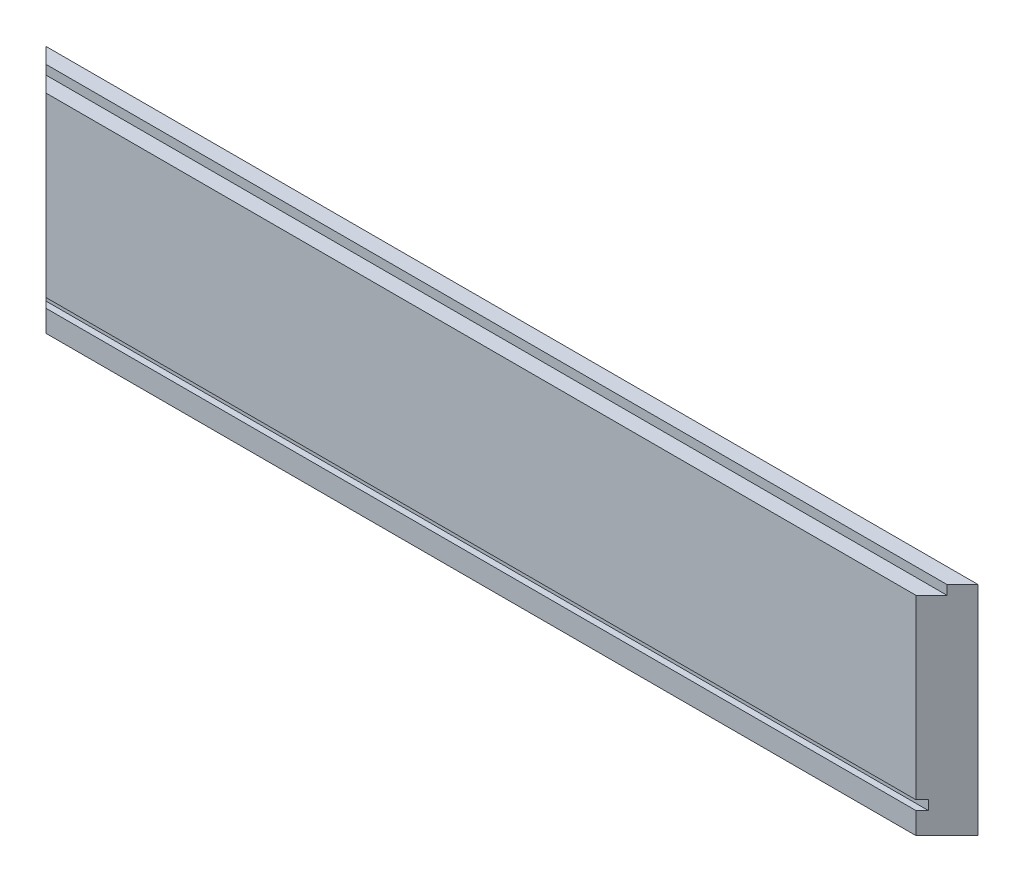
ISO-10303-21;
HEADER;
FILE_DESCRIPTION(('STEP AP214'),'2;1');
FILE_NAME('part.step','',(''),(''),'','','');
FILE_SCHEMA(('AUTOMOTIVE_DESIGN { 1 0 10303 214 1 1 1 1 }'));
ENDSEC;
DATA;
#1=APPLICATION_CONTEXT('core data for automotive mechanical design processes');
#2=APPLICATION_PROTOCOL_DEFINITION('international standard','automotive_design',2000,#1);
#3=PRODUCT_CONTEXT('',#1,'mechanical');
#4=PRODUCT('Part','Part','',(#3));
#5=PRODUCT_RELATED_PRODUCT_CATEGORY('part','',(#4));
#6=PRODUCT_DEFINITION_FORMATION('','',#4);
#7=PRODUCT_DEFINITION_CONTEXT('part definition',#1,'design');
#8=PRODUCT_DEFINITION('design','',#6,#7);
#9=PRODUCT_DEFINITION_SHAPE('','',#8);
#10=(LENGTH_UNIT() NAMED_UNIT(*) SI_UNIT(.MILLI.,.METRE.));
#11=(NAMED_UNIT(*) PLANE_ANGLE_UNIT() SI_UNIT($,.RADIAN.));
#12=(NAMED_UNIT(*) SI_UNIT($,.STERADIAN.) SOLID_ANGLE_UNIT());
#13=UNCERTAINTY_MEASURE_WITH_UNIT(LENGTH_MEASURE(1.E-05),#10,'distance_accuracy_value','');
#14=(GEOMETRIC_REPRESENTATION_CONTEXT(3) GLOBAL_UNCERTAINTY_ASSIGNED_CONTEXT((#13)) GLOBAL_UNIT_ASSIGNED_CONTEXT((#10,
#11,#12)) REPRESENTATION_CONTEXT('',''));
#15=CARTESIAN_POINT('',(0.,0.,0.));
#16=DIRECTION('',(0.,0.,1.));
#17=DIRECTION('',(1.,0.,0.));
#18=AXIS2_PLACEMENT_3D('',#15,#16,#17);
#19=CARTESIAN_POINT('',(0.,70.,0.));
#20=DIRECTION('',(0.,0.,-1.));
#21=DIRECTION('',(-1.,0.,0.));
#22=AXIS2_PLACEMENT_3D('',#19,#20,#21);
#23=PLANE('',#22);
#24=DIRECTION('',(0.,-1.,0.));
#25=VECTOR('',#24,1.);
#26=CARTESIAN_POINT('',(10.,70.,0.));
#27=LINE('',#26,#25);
#28=CARTESIAN_POINT('',(10.,67.,0.));
#29=VERTEX_POINT('',#28);
#30=CARTESIAN_POINT('',(10.,10.,0.));
#31=VERTEX_POINT('',#30);
#32=EDGE_CURVE('E135',#29,#31,#27,.T.);
#33=ORIENTED_EDGE('',*,*,#32,.T.);
#34=DIRECTION('',(-1.,0.,0.));
#35=VECTOR('',#34,1.);
#36=CARTESIAN_POINT('',(0.,10.,0.));
#37=LINE('',#36,#35);
#38=CARTESIAN_POINT('',(290.,10.,0.));
#39=VERTEX_POINT('',#38);
#40=EDGE_CURVE('E128',#39,#31,#37,.T.);
#41=ORIENTED_EDGE('',*,*,#40,.F.);
#42=DIRECTION('',(0.,-1.,0.));
#43=VECTOR('',#42,1.);
#44=CARTESIAN_POINT('',(290.,70.,0.));
#45=LINE('',#44,#43);
#46=CARTESIAN_POINT('',(290.,67.,0.));
#47=VERTEX_POINT('',#46);
#48=EDGE_CURVE('E136',#47,#39,#45,.T.);
#49=ORIENTED_EDGE('',*,*,#48,.F.);
#50=DIRECTION('',(1.,0.,0.));
#51=VECTOR('',#50,1.);
#52=CARTESIAN_POINT('',(0.,67.,0.));
#53=LINE('',#52,#51);
#54=EDGE_CURVE('E158',#29,#47,#53,.T.);
#55=ORIENTED_EDGE('',*,*,#54,.F.);
#56=EDGE_LOOP('',(#33,#41,#49,#55));
#57=FACE_BOUND('',#56,.T.);
#58=ADVANCED_FACE('F35',(#57),#23,.F.);
#59=CARTESIAN_POINT('',(290.,7.,0.));
#60=VERTEX_POINT('',#59);
#61=CARTESIAN_POINT('',(290.,0.,0.));
#62=VERTEX_POINT('',#61);
#63=EDGE_CURVE('E127',#60,#62,#45,.T.);
#64=ORIENTED_EDGE('',*,*,#63,.F.);
#65=DIRECTION('',(1.,0.,0.));
#66=VECTOR('',#65,1.);
#67=CARTESIAN_POINT('',(0.,7.00000000000001,0.));
#68=LINE('',#67,#66);
#69=CARTESIAN_POINT('',(10.,7.00000000000001,0.));
#70=VERTEX_POINT('',#69);
#71=EDGE_CURVE('E113',#70,#60,#68,.T.);
#72=ORIENTED_EDGE('',*,*,#71,.F.);
#73=CARTESIAN_POINT('',(10.,0.,0.));
#74=VERTEX_POINT('',#73);
#75=EDGE_CURVE('E125',#70,#74,#27,.T.);
#76=ORIENTED_EDGE('',*,*,#75,.T.);
#77=DIRECTION('',(1.,0.,0.));
#78=VECTOR('',#77,1.);
#79=CARTESIAN_POINT('',(0.,0.,0.));
#80=LINE('',#79,#78);
#81=EDGE_CURVE('E178',#74,#62,#80,.T.);
#82=ORIENTED_EDGE('',*,*,#81,.T.);
#83=EDGE_LOOP('',(#64,#72,#76,#82));
#84=FACE_BOUND('',#83,.T.);
#85=ADVANCED_FACE('F123',(#84),#23,.F.);
#86=CARTESIAN_POINT('',(145.,70.,145.));
#87=DIRECTION('',(0.707106781186547,0.,0.707106781186548));
#88=DIRECTION('',(0.707106781186548,0.,-0.707106781186547));
#89=AXIS2_PLACEMENT_3D('',#86,#87,#88);
#90=PLANE('',#89);
#91=DIRECTION('',(-0.707106781186548,0.,0.707106781186547));
#92=VECTOR('',#91,1.);
#93=CARTESIAN_POINT('',(145.,10.,145.));
#94=LINE('',#93,#92);
#95=CARTESIAN_POINT('',(292.,10.,-2.));
#96=VERTEX_POINT('',#95);
#97=EDGE_CURVE('E197',#96,#39,#94,.T.);
#98=ORIENTED_EDGE('',*,*,#97,.F.);
#99=DIRECTION('',(0.,1.,0.));
#100=VECTOR('',#99,1.);
#101=CARTESIAN_POINT('',(292.,70.,-2.));
#102=LINE('',#101,#100);
#103=CARTESIAN_POINT('',(292.,7.,-2.));
#104=VERTEX_POINT('',#103);
#105=EDGE_CURVE('E196',#104,#96,#102,.T.);
#106=ORIENTED_EDGE('',*,*,#105,.F.);
#107=DIRECTION('',(0.707106781186548,0.,-0.707106781186547));
#108=VECTOR('',#107,1.);
#109=CARTESIAN_POINT('',(145.,7.00000000000001,145.));
#110=LINE('',#109,#108);
#111=EDGE_CURVE('E195',#60,#104,#110,.T.);
#112=ORIENTED_EDGE('',*,*,#111,.F.);
#113=ORIENTED_EDGE('',*,*,#63,.T.);
#114=DIRECTION('',(-0.707106781186548,0.,0.707106781186547));
#115=VECTOR('',#114,1.);
#116=CARTESIAN_POINT('',(145.,0.,145.));
#117=LINE('',#116,#115);
#118=CARTESIAN_POINT('',(300.,0.,-10.));
#119=VERTEX_POINT('',#118);
#120=EDGE_CURVE('E173',#119,#62,#117,.T.);
#121=ORIENTED_EDGE('',*,*,#120,.F.);
#122=DIRECTION('',(0.,-1.,0.));
#123=VECTOR('',#122,1.);
#124=CARTESIAN_POINT('',(300.,70.,-10.));
#125=LINE('',#124,#123);
#126=CARTESIAN_POINT('',(300.,70.,-10.));
#127=VERTEX_POINT('',#126);
#128=EDGE_CURVE('E145',#127,#119,#125,.T.);
#129=ORIENTED_EDGE('',*,*,#128,.F.);
#130=DIRECTION('',(-0.707106781186548,0.,0.707106781186547));
#131=VECTOR('',#130,1.);
#132=CARTESIAN_POINT('',(145.,70.,145.));
#133=LINE('',#132,#131);
#134=CARTESIAN_POINT('',(295.,70.,-4.99999999999998));
#135=VERTEX_POINT('',#134);
#136=EDGE_CURVE('E174',#127,#135,#133,.T.);
#137=ORIENTED_EDGE('',*,*,#136,.T.);
#138=DIRECTION('',(0.,-1.,0.));
#139=VECTOR('',#138,1.);
#140=CARTESIAN_POINT('',(295.,70.000012,-5.));
#141=LINE('',#140,#139);
#142=CARTESIAN_POINT('',(295.,67.,-5.));
#143=VERTEX_POINT('',#142);
#144=EDGE_CURVE('E57',#135,#143,#141,.T.);
#145=ORIENTED_EDGE('',*,*,#144,.T.);
#146=DIRECTION('',(0.707106781186548,0.,-0.707106781186547));
#147=VECTOR('',#146,1.);
#148=CARTESIAN_POINT('',(145.,67.,145.));
#149=LINE('',#148,#147);
#150=EDGE_CURVE('E162',#47,#143,#149,.T.);
#151=ORIENTED_EDGE('',*,*,#150,.F.);
#152=ORIENTED_EDGE('',*,*,#48,.T.);
#153=EDGE_LOOP('',(#98,#106,#112,#113,#121,#129,#137,#145,#151,#152));
#154=FACE_BOUND('',#153,.T.);
#155=ADVANCED_FACE('F37',(#154),#90,.T.);
#156=CARTESIAN_POINT('',(0.,70.,-10.));
#157=DIRECTION('',(0.,0.,-1.));
#158=DIRECTION('',(-1.,0.,0.));
#159=AXIS2_PLACEMENT_3D('',#156,#157,#158);
#160=PLANE('',#159);
#161=DIRECTION('',(1.,0.,0.));
#162=VECTOR('',#161,1.);
#163=CARTESIAN_POINT('',(0.,0.,-10.));
#164=LINE('',#163,#162);
#165=CARTESIAN_POINT('',(0.,0.,-10.));
#166=VERTEX_POINT('',#165);
#167=EDGE_CURVE('E185',#166,#119,#164,.T.);
#168=ORIENTED_EDGE('',*,*,#167,.F.);
#169=DIRECTION('',(0.,-1.,0.));
#170=VECTOR('',#169,1.);
#171=CARTESIAN_POINT('',(0.,70.,-10.));
#172=LINE('',#171,#170);
#173=CARTESIAN_POINT('',(0.,70.,-10.));
#174=VERTEX_POINT('',#173);
#175=EDGE_CURVE('E139',#174,#166,#172,.T.);
#176=ORIENTED_EDGE('',*,*,#175,.F.);
#177=DIRECTION('',(1.,0.,0.));
#178=VECTOR('',#177,1.);
#179=CARTESIAN_POINT('',(0.,70.,-10.));
#180=LINE('',#179,#178);
#181=EDGE_CURVE('E177',#174,#127,#180,.T.);
#182=ORIENTED_EDGE('',*,*,#181,.T.);
#183=ORIENTED_EDGE('',*,*,#128,.T.);
#184=EDGE_LOOP('',(#168,#176,#182,#183));
#185=FACE_BOUND('',#184,.T.);
#186=ADVANCED_FACE('F212',(#185),#160,.T.);
#187=CARTESIAN_POINT('',(5.,70.,-5.));
#188=DIRECTION('',(-0.707106781186548,0.,0.707106781186548));
#189=DIRECTION('',(0.707106781186548,0.,0.707106781186548));
#190=AXIS2_PLACEMENT_3D('',#187,#188,#189);
#191=PLANE('',#190);
#192=DIRECTION('',(-0.707106781186548,0.,-0.707106781186548));
#193=VECTOR('',#192,1.);
#194=CARTESIAN_POINT('',(5.,10.,-5.));
#195=LINE('',#194,#193);
#196=CARTESIAN_POINT('',(8.,10.,-2.));
#197=VERTEX_POINT('',#196);
#198=EDGE_CURVE('E11',#31,#197,#195,.T.);
#199=ORIENTED_EDGE('',*,*,#198,.F.);
#200=ORIENTED_EDGE('',*,*,#32,.F.);
#201=DIRECTION('',(0.707106781186548,0.,0.707106781186548));
#202=VECTOR('',#201,1.);
#203=CARTESIAN_POINT('',(5.,67.,-5.));
#204=LINE('',#203,#202);
#205=CARTESIAN_POINT('',(5.,67.,-5.));
#206=VERTEX_POINT('',#205);
#207=EDGE_CURVE('E163',#206,#29,#204,.T.);
#208=ORIENTED_EDGE('',*,*,#207,.F.);
#209=DIRECTION('',(0.,-1.,0.));
#210=VECTOR('',#209,1.);
#211=CARTESIAN_POINT('',(5.,70.000012,-5.));
#212=LINE('',#211,#210);
#213=CARTESIAN_POINT('',(5.,70.,-5.));
#214=VERTEX_POINT('',#213);
#215=EDGE_CURVE('E171',#214,#206,#212,.T.);
#216=ORIENTED_EDGE('',*,*,#215,.F.);
#217=DIRECTION('',(-0.707106781186548,0.,-0.707106781186548));
#218=VECTOR('',#217,1.);
#219=CARTESIAN_POINT('',(5.,70.,-5.));
#220=LINE('',#219,#218);
#221=EDGE_CURVE('E181',#214,#174,#220,.T.);
#222=ORIENTED_EDGE('',*,*,#221,.T.);
#223=ORIENTED_EDGE('',*,*,#175,.T.);
#224=DIRECTION('',(-0.707106781186548,0.,-0.707106781186548));
#225=VECTOR('',#224,1.);
#226=CARTESIAN_POINT('',(5.,0.,-5.));
#227=LINE('',#226,#225);
#228=EDGE_CURVE('E134',#74,#166,#227,.T.);
#229=ORIENTED_EDGE('',*,*,#228,.F.);
#230=ORIENTED_EDGE('',*,*,#75,.F.);
#231=DIRECTION('',(0.707106781186548,0.,0.707106781186548));
#232=VECTOR('',#231,1.);
#233=CARTESIAN_POINT('',(5.,7.00000000000001,-5.));
#234=LINE('',#233,#232);
#235=CARTESIAN_POINT('',(8.,7.00000000000001,-2.));
#236=VERTEX_POINT('',#235);
#237=EDGE_CURVE('E43',#236,#70,#234,.T.);
#238=ORIENTED_EDGE('',*,*,#237,.F.);
#239=DIRECTION('',(0.,-1.,0.));
#240=VECTOR('',#239,1.);
#241=CARTESIAN_POINT('',(8.,70.,-2.));
#242=LINE('',#241,#240);
#243=EDGE_CURVE('E120',#197,#236,#242,.T.);
#244=ORIENTED_EDGE('',*,*,#243,.F.);
#245=EDGE_LOOP('',(#199,#200,#208,#216,#222,#223,#229,#230,#238,#244));
#246=FACE_BOUND('',#245,.T.);
#247=ADVANCED_FACE('F132',(#246),#191,.T.);
#248=CARTESIAN_POINT('',(0.,70.,0.));
#249=DIRECTION('',(0.,1.,0.));
#250=DIRECTION('',(0.,0.,1.));
#251=AXIS2_PLACEMENT_3D('',#248,#249,#250);
#252=PLANE('',#251);
#253=DIRECTION('',(-1.,0.,0.));
#254=VECTOR('',#253,1.);
#255=CARTESIAN_POINT('',(0.,70.,-5.));
#256=LINE('',#255,#254);
#257=EDGE_CURVE('E147',#135,#214,#256,.T.);
#258=ORIENTED_EDGE('',*,*,#257,.F.);
#259=ORIENTED_EDGE('',*,*,#136,.F.);
#260=ORIENTED_EDGE('',*,*,#181,.F.);
#261=ORIENTED_EDGE('',*,*,#221,.F.);
#262=EDGE_LOOP('',(#258,#259,#260,#261));
#263=FACE_BOUND('',#262,.T.);
#264=ADVANCED_FACE('F208',(#263),#252,.T.);
#265=CARTESIAN_POINT('',(0.,0.,0.));
#266=DIRECTION('',(0.,1.,0.));
#267=DIRECTION('',(0.,0.,1.));
#268=AXIS2_PLACEMENT_3D('',#265,#266,#267);
#269=PLANE('',#268);
#270=ORIENTED_EDGE('',*,*,#120,.T.);
#271=ORIENTED_EDGE('',*,*,#81,.F.);
#272=ORIENTED_EDGE('',*,*,#228,.T.);
#273=ORIENTED_EDGE('',*,*,#167,.T.);
#274=EDGE_LOOP('',(#270,#271,#272,#273));
#275=FACE_BOUND('',#274,.T.);
#276=ADVANCED_FACE('F190',(#275),#269,.F.);
#277=CARTESIAN_POINT('',(0.,70.000012,-5.));
#278=DIRECTION('',(0.,0.,-1.));
#279=DIRECTION('',(-1.,0.,0.));
#280=AXIS2_PLACEMENT_3D('',#277,#278,#279);
#281=PLANE('',#280);
#282=ORIENTED_EDGE('',*,*,#257,.T.);
#283=ORIENTED_EDGE('',*,*,#215,.T.);
#284=DIRECTION('',(1.,0.,0.));
#285=VECTOR('',#284,1.);
#286=CARTESIAN_POINT('',(0.,67.,-5.));
#287=LINE('',#286,#285);
#288=EDGE_CURVE('E166',#206,#143,#287,.T.);
#289=ORIENTED_EDGE('',*,*,#288,.T.);
#290=ORIENTED_EDGE('',*,*,#144,.F.);
#291=EDGE_LOOP('',(#282,#283,#289,#290));
#292=FACE_BOUND('',#291,.T.);
#293=ADVANCED_FACE('F203',(#292),#281,.F.);
#294=CARTESIAN_POINT('',(0.,67.,0.));
#295=DIRECTION('',(0.,1.,0.));
#296=DIRECTION('',(0.,0.,1.));
#297=AXIS2_PLACEMENT_3D('',#294,#295,#296);
#298=PLANE('',#297);
#299=ORIENTED_EDGE('',*,*,#288,.F.);
#300=ORIENTED_EDGE('',*,*,#207,.T.);
#301=ORIENTED_EDGE('',*,*,#54,.T.);
#302=ORIENTED_EDGE('',*,*,#150,.T.);
#303=EDGE_LOOP('',(#299,#300,#301,#302));
#304=FACE_BOUND('',#303,.T.);
#305=ADVANCED_FACE('F205',(#304),#298,.T.);
#306=CARTESIAN_POINT('',(0.,10.,-2.));
#307=DIRECTION('',(0.,1.,0.));
#308=DIRECTION('',(-1.,0.,0.));
#309=AXIS2_PLACEMENT_3D('',#306,#307,#308);
#310=PLANE('',#309);
#311=ORIENTED_EDGE('',*,*,#97,.T.);
#312=ORIENTED_EDGE('',*,*,#40,.T.);
#313=ORIENTED_EDGE('',*,*,#198,.T.);
#314=DIRECTION('',(-1.,0.,0.));
#315=VECTOR('',#314,1.);
#316=CARTESIAN_POINT('',(0.,10.,-2.));
#317=LINE('',#316,#315);
#318=EDGE_CURVE('E50',#96,#197,#317,.T.);
#319=ORIENTED_EDGE('',*,*,#318,.F.);
#320=EDGE_LOOP('',(#311,#312,#313,#319));
#321=FACE_BOUND('',#320,.T.);
#322=ADVANCED_FACE('F233',(#321),#310,.F.);
#323=CARTESIAN_POINT('',(0.,7.00000000000001,-2.));
#324=DIRECTION('',(0.,-1.,0.));
#325=DIRECTION('',(1.,0.,0.));
#326=AXIS2_PLACEMENT_3D('',#323,#324,#325);
#327=PLANE('',#326);
#328=ORIENTED_EDGE('',*,*,#111,.T.);
#329=DIRECTION('',(1.,0.,0.));
#330=VECTOR('',#329,1.);
#331=CARTESIAN_POINT('',(0.,7.00000000000001,-2.));
#332=LINE('',#331,#330);
#333=EDGE_CURVE('E116',#236,#104,#332,.T.);
#334=ORIENTED_EDGE('',*,*,#333,.F.);
#335=ORIENTED_EDGE('',*,*,#237,.T.);
#336=ORIENTED_EDGE('',*,*,#71,.T.);
#337=EDGE_LOOP('',(#328,#334,#335,#336));
#338=FACE_BOUND('',#337,.T.);
#339=ADVANCED_FACE('F112',(#338),#327,.F.);
#340=CARTESIAN_POINT('',(0.,0.,-2.));
#341=DIRECTION('',(0.,0.,-1.));
#342=DIRECTION('',(-1.,0.,0.));
#343=AXIS2_PLACEMENT_3D('',#340,#341,#342);
#344=PLANE('',#343);
#345=ORIENTED_EDGE('',*,*,#105,.T.);
#346=ORIENTED_EDGE('',*,*,#318,.T.);
#347=ORIENTED_EDGE('',*,*,#243,.T.);
#348=ORIENTED_EDGE('',*,*,#333,.T.);
#349=EDGE_LOOP('',(#345,#346,#347,#348));
#350=FACE_BOUND('',#349,.T.);
#351=ADVANCED_FACE('F149',(#350),#344,.F.);
#352=CLOSED_SHELL('',(#58,#85,#155,#186,#247,#264,#276,#293,#305,#322,#339,#351));
#353=MANIFOLD_SOLID_BREP('B2',#352);
#354=ADVANCED_BREP_SHAPE_REPRESENTATION('',(#18,#353),#14);
#355=SHAPE_DEFINITION_REPRESENTATION(#9,#354);
ENDSEC;
END-ISO-10303-21;
